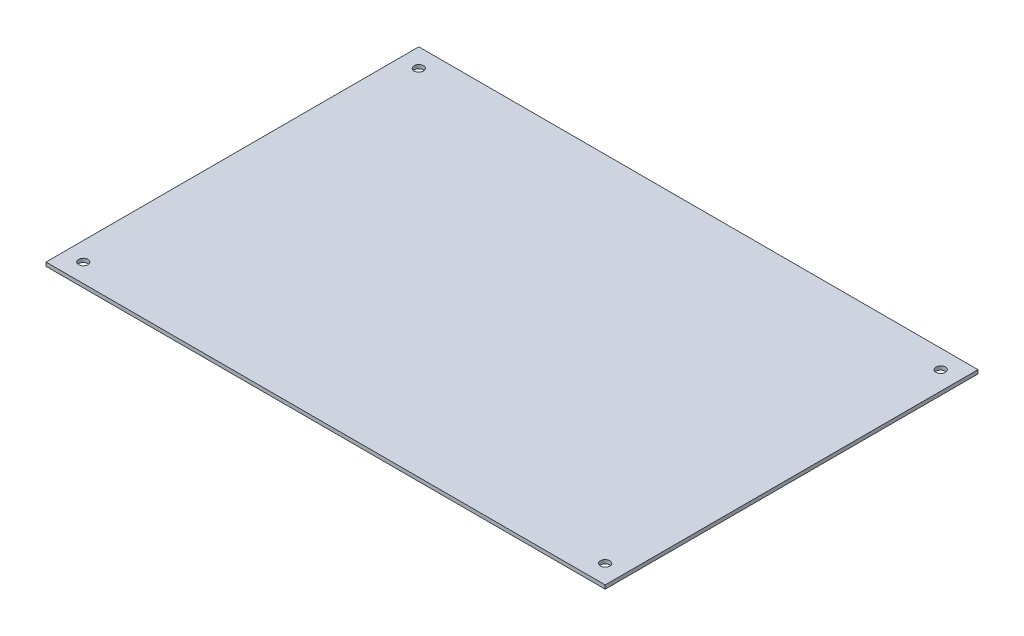
ISO-10303-21;
HEADER;
FILE_DESCRIPTION(('STEP AP214'),'2;1');
FILE_NAME('part.step','',(''),(''),'','','');
FILE_SCHEMA(('AUTOMOTIVE_DESIGN { 1 0 10303 214 1 1 1 1 }'));
ENDSEC;
DATA;
#1=APPLICATION_CONTEXT('core data for automotive mechanical design processes');
#2=APPLICATION_PROTOCOL_DEFINITION('international standard','automotive_design',2000,#1);
#3=PRODUCT_CONTEXT('',#1,'mechanical');
#4=PRODUCT('Part','Part','',(#3));
#5=PRODUCT_RELATED_PRODUCT_CATEGORY('part','',(#4));
#6=PRODUCT_DEFINITION_FORMATION('','',#4);
#7=PRODUCT_DEFINITION_CONTEXT('part definition',#1,'design');
#8=PRODUCT_DEFINITION('design','',#6,#7);
#9=PRODUCT_DEFINITION_SHAPE('','',#8);
#10=(LENGTH_UNIT() NAMED_UNIT(*) SI_UNIT(.MILLI.,.METRE.));
#11=(NAMED_UNIT(*) PLANE_ANGLE_UNIT() SI_UNIT($,.RADIAN.));
#12=(NAMED_UNIT(*) SI_UNIT($,.STERADIAN.) SOLID_ANGLE_UNIT());
#13=UNCERTAINTY_MEASURE_WITH_UNIT(LENGTH_MEASURE(1.E-05),#10,'distance_accuracy_value','');
#14=(GEOMETRIC_REPRESENTATION_CONTEXT(3) GLOBAL_UNCERTAINTY_ASSIGNED_CONTEXT((#13)) GLOBAL_UNIT_ASSIGNED_CONTEXT((#10,
#11,#12)) REPRESENTATION_CONTEXT('',''));
#15=CARTESIAN_POINT('',(0.,0.,0.));
#16=DIRECTION('',(0.,0.,1.));
#17=DIRECTION('',(1.,0.,0.));
#18=AXIS2_PLACEMENT_3D('',#15,#16,#17);
#19=CARTESIAN_POINT('',(263.05542944957,2.,0.));
#20=DIRECTION('',(1.,0.,0.));
#21=DIRECTION('',(0.,0.,-1.));
#22=AXIS2_PLACEMENT_3D('',#19,#20,#21);
#23=PLANE('',#22);
#24=DIRECTION('',(0.,0.,1.));
#25=VECTOR('',#24,1.);
#26=CARTESIAN_POINT('',(263.05542944957,0.,0.));
#27=LINE('',#26,#25);
#28=CARTESIAN_POINT('',(263.05542944957,0.,-34.7359277457848));
#29=VERTEX_POINT('',#28);
#30=CARTESIAN_POINT('',(263.05542944957,0.,165.264072254215));
#31=VERTEX_POINT('',#30);
#32=EDGE_CURVE('E114',#29,#31,#27,.T.);
#33=ORIENTED_EDGE('',*,*,#32,.F.);
#34=DIRECTION('',(0.,-1.,0.));
#35=VECTOR('',#34,1.);
#36=CARTESIAN_POINT('',(263.05542944957,2.,-34.7359277457848));
#37=LINE('',#36,#35);
#38=CARTESIAN_POINT('',(263.05542944957,2.,-34.7359277457848));
#39=VERTEX_POINT('',#38);
#40=EDGE_CURVE('E11',#39,#29,#37,.T.);
#41=ORIENTED_EDGE('',*,*,#40,.F.);
#42=DIRECTION('',(0.,0.,1.));
#43=VECTOR('',#42,1.);
#44=CARTESIAN_POINT('',(263.05542944957,2.,0.));
#45=LINE('',#44,#43);
#46=CARTESIAN_POINT('',(263.05542944957,2.,165.264072254215));
#47=VERTEX_POINT('',#46);
#48=EDGE_CURVE('E95',#39,#47,#45,.T.);
#49=ORIENTED_EDGE('',*,*,#48,.T.);
#50=DIRECTION('',(0.,-1.,0.));
#51=VECTOR('',#50,1.);
#52=CARTESIAN_POINT('',(263.05542944957,2.,165.264072254215));
#53=LINE('',#52,#51);
#54=EDGE_CURVE('E74',#47,#31,#53,.T.);
#55=ORIENTED_EDGE('',*,*,#54,.T.);
#56=EDGE_LOOP('',(#33,#41,#49,#55));
#57=FACE_BOUND('',#56,.T.);
#58=ADVANCED_FACE('F34',(#57),#23,.T.);
#59=CARTESIAN_POINT('',(0.,2.,-34.7359277457848));
#60=DIRECTION('',(0.,0.,-1.));
#61=DIRECTION('',(-1.,0.,0.));
#62=AXIS2_PLACEMENT_3D('',#59,#60,#61);
#63=PLANE('',#62);
#64=DIRECTION('',(1.,0.,0.));
#65=VECTOR('',#64,1.);
#66=CARTESIAN_POINT('',(0.,0.,-34.7359277457848));
#67=LINE('',#66,#65);
#68=CARTESIAN_POINT('',(-36.94457055043,0.,-34.7359277457848));
#69=VERTEX_POINT('',#68);
#70=EDGE_CURVE('E86',#69,#29,#67,.T.);
#71=ORIENTED_EDGE('',*,*,#70,.F.);
#72=DIRECTION('',(0.,-1.,0.));
#73=VECTOR('',#72,1.);
#74=CARTESIAN_POINT('',(-36.94457055043,2.,-34.7359277457848));
#75=LINE('',#74,#73);
#76=CARTESIAN_POINT('',(-36.94457055043,2.,-34.7359277457848));
#77=VERTEX_POINT('',#76);
#78=EDGE_CURVE('E43',#77,#69,#75,.T.);
#79=ORIENTED_EDGE('',*,*,#78,.F.);
#80=DIRECTION('',(1.,0.,0.));
#81=VECTOR('',#80,1.);
#82=CARTESIAN_POINT('',(0.,2.,-34.7359277457848));
#83=LINE('',#82,#81);
#84=EDGE_CURVE('E84',#77,#39,#83,.T.);
#85=ORIENTED_EDGE('',*,*,#84,.T.);
#86=ORIENTED_EDGE('',*,*,#40,.T.);
#87=EDGE_LOOP('',(#71,#79,#85,#86));
#88=FACE_BOUND('',#87,.T.);
#89=ADVANCED_FACE('F82',(#88),#63,.T.);
#90=CARTESIAN_POINT('',(-36.94457055043,2.,0.));
#91=DIRECTION('',(1.,0.,0.));
#92=DIRECTION('',(0.,0.,-1.));
#93=AXIS2_PLACEMENT_3D('',#90,#91,#92);
#94=PLANE('',#93);
#95=DIRECTION('',(0.,0.,1.));
#96=VECTOR('',#95,1.);
#97=CARTESIAN_POINT('',(-36.94457055043,0.,0.));
#98=LINE('',#97,#96);
#99=CARTESIAN_POINT('',(-36.94457055043,0.,165.264072254215));
#100=VERTEX_POINT('',#99);
#101=EDGE_CURVE('E117',#69,#100,#98,.T.);
#102=ORIENTED_EDGE('',*,*,#101,.T.);
#103=DIRECTION('',(0.,-1.,0.));
#104=VECTOR('',#103,1.);
#105=CARTESIAN_POINT('',(-36.94457055043,2.,165.264072254215));
#106=LINE('',#105,#104);
#107=CARTESIAN_POINT('',(-36.94457055043,2.,165.264072254215));
#108=VERTEX_POINT('',#107);
#109=EDGE_CURVE('E89',#108,#100,#106,.T.);
#110=ORIENTED_EDGE('',*,*,#109,.F.);
#111=DIRECTION('',(0.,0.,1.));
#112=VECTOR('',#111,1.);
#113=CARTESIAN_POINT('',(-36.94457055043,2.,0.));
#114=LINE('',#113,#112);
#115=EDGE_CURVE('E91',#77,#108,#114,.T.);
#116=ORIENTED_EDGE('',*,*,#115,.F.);
#117=ORIENTED_EDGE('',*,*,#78,.T.);
#118=EDGE_LOOP('',(#102,#110,#116,#117));
#119=FACE_BOUND('',#118,.T.);
#120=ADVANCED_FACE('F92',(#119),#94,.F.);
#121=CARTESIAN_POINT('',(-26.94457055043,2.,-24.7359277457848));
#122=DIRECTION('',(0.,-1.,0.));
#123=DIRECTION('',(0.,0.,-1.));
#124=AXIS2_PLACEMENT_3D('',#121,#122,#123);
#125=CYLINDRICAL_SURFACE('',#124,2.5);
#126=CARTESIAN_POINT('',(-26.94457055043,2.,-24.7359277457848));
#127=DIRECTION('',(0.,1.,0.));
#128=DIRECTION('',(0.,0.,1.));
#129=AXIS2_PLACEMENT_3D('',#126,#127,#128);
#130=CIRCLE('',#129,2.5);
#131=CARTESIAN_POINT('',(-26.94457055043,2.,-22.2359277457848));
#132=VERTEX_POINT('',#131);
#133=EDGE_CURVE('E97',#132,#132,#130,.T.);
#134=ORIENTED_EDGE('',*,*,#133,.T.);
#135=EDGE_LOOP('',(#134));
#136=FACE_BOUND('',#135,.T.);
#137=CARTESIAN_POINT('',(-26.94457055043,0.,-24.7359277457848));
#138=DIRECTION('',(0.,1.,0.));
#139=DIRECTION('',(0.,0.,1.));
#140=AXIS2_PLACEMENT_3D('',#137,#138,#139);
#141=CIRCLE('',#140,2.5);
#142=CARTESIAN_POINT('',(-26.94457055043,0.,-22.2359277457848));
#143=VERTEX_POINT('',#142);
#144=EDGE_CURVE('E111',#143,#143,#141,.T.);
#145=ORIENTED_EDGE('',*,*,#144,.F.);
#146=EDGE_LOOP('',(#145));
#147=FACE_BOUND('',#146,.T.);
#148=ADVANCED_FACE('F133',(#136,#147),#125,.F.);
#149=CARTESIAN_POINT('',(253.05542944957,2.,-24.7359277457848));
#150=DIRECTION('',(0.,-1.,0.));
#151=DIRECTION('',(0.,0.,-1.));
#152=AXIS2_PLACEMENT_3D('',#149,#150,#151);
#153=CYLINDRICAL_SURFACE('',#152,2.50000000000002);
#154=CARTESIAN_POINT('',(253.05542944957,2.,-24.7359277457848));
#155=DIRECTION('',(0.,1.,0.));
#156=DIRECTION('',(0.,0.,1.));
#157=AXIS2_PLACEMENT_3D('',#154,#155,#156);
#158=CIRCLE('',#157,2.50000000000002);
#159=CARTESIAN_POINT('',(253.05542944957,2.,-22.2359277457848));
#160=VERTEX_POINT('',#159);
#161=EDGE_CURVE('E245',#160,#160,#158,.T.);
#162=ORIENTED_EDGE('',*,*,#161,.T.);
#163=EDGE_LOOP('',(#162));
#164=FACE_BOUND('',#163,.T.);
#165=CARTESIAN_POINT('',(253.05542944957,0.,-24.7359277457848));
#166=DIRECTION('',(0.,1.,0.));
#167=DIRECTION('',(0.,0.,1.));
#168=AXIS2_PLACEMENT_3D('',#165,#166,#167);
#169=CIRCLE('',#168,2.50000000000002);
#170=CARTESIAN_POINT('',(253.05542944957,0.,-22.2359277457848));
#171=VERTEX_POINT('',#170);
#172=EDGE_CURVE('E108',#171,#171,#169,.T.);
#173=ORIENTED_EDGE('',*,*,#172,.F.);
#174=EDGE_LOOP('',(#173));
#175=FACE_BOUND('',#174,.T.);
#176=ADVANCED_FACE('F136',(#164,#175),#153,.F.);
#177=CARTESIAN_POINT('',(253.05542944957,2.,155.264072254215));
#178=DIRECTION('',(0.,-1.,0.));
#179=DIRECTION('',(0.,0.,-1.));
#180=AXIS2_PLACEMENT_3D('',#177,#178,#179);
#181=CYLINDRICAL_SURFACE('',#180,2.50000000000002);
#182=CARTESIAN_POINT('',(253.05542944957,2.,155.264072254215));
#183=DIRECTION('',(0.,1.,0.));
#184=DIRECTION('',(0.,0.,1.));
#185=AXIS2_PLACEMENT_3D('',#182,#183,#184);
#186=CIRCLE('',#185,2.50000000000002);
#187=CARTESIAN_POINT('',(253.05542944957,2.,157.764072254215));
#188=VERTEX_POINT('',#187);
#189=EDGE_CURVE('E150',#188,#188,#186,.T.);
#190=ORIENTED_EDGE('',*,*,#189,.T.);
#191=EDGE_LOOP('',(#190));
#192=FACE_BOUND('',#191,.T.);
#193=CARTESIAN_POINT('',(253.05542944957,0.,155.264072254215));
#194=DIRECTION('',(0.,1.,0.));
#195=DIRECTION('',(0.,0.,1.));
#196=AXIS2_PLACEMENT_3D('',#193,#194,#195);
#197=CIRCLE('',#196,2.50000000000002);
#198=CARTESIAN_POINT('',(253.05542944957,0.,157.764072254215));
#199=VERTEX_POINT('',#198);
#200=EDGE_CURVE('E105',#199,#199,#197,.T.);
#201=ORIENTED_EDGE('',*,*,#200,.F.);
#202=EDGE_LOOP('',(#201));
#203=FACE_BOUND('',#202,.T.);
#204=ADVANCED_FACE('F139',(#192,#203),#181,.F.);
#205=CARTESIAN_POINT('',(-26.94457055043,2.,155.264072254215));
#206=DIRECTION('',(0.,-1.,0.));
#207=DIRECTION('',(0.,0.,-1.));
#208=AXIS2_PLACEMENT_3D('',#205,#206,#207);
#209=CYLINDRICAL_SURFACE('',#208,2.5);
#210=CARTESIAN_POINT('',(-26.94457055043,2.,155.264072254215));
#211=DIRECTION('',(0.,1.,0.));
#212=DIRECTION('',(0.,0.,1.));
#213=AXIS2_PLACEMENT_3D('',#210,#211,#212);
#214=CIRCLE('',#213,2.5);
#215=CARTESIAN_POINT('',(-26.94457055043,2.,157.764072254215));
#216=VERTEX_POINT('',#215);
#217=EDGE_CURVE('E120',#216,#216,#214,.T.);
#218=ORIENTED_EDGE('',*,*,#217,.T.);
#219=EDGE_LOOP('',(#218));
#220=FACE_BOUND('',#219,.T.);
#221=CARTESIAN_POINT('',(-26.94457055043,0.,155.264072254215));
#222=DIRECTION('',(0.,1.,0.));
#223=DIRECTION('',(0.,0.,1.));
#224=AXIS2_PLACEMENT_3D('',#221,#222,#223);
#225=CIRCLE('',#224,2.5);
#226=CARTESIAN_POINT('',(-26.94457055043,0.,157.764072254215));
#227=VERTEX_POINT('',#226);
#228=EDGE_CURVE('E102',#227,#227,#225,.T.);
#229=ORIENTED_EDGE('',*,*,#228,.F.);
#230=EDGE_LOOP('',(#229));
#231=FACE_BOUND('',#230,.T.);
#232=ADVANCED_FACE('F36',(#220,#231),#209,.F.);
#233=CARTESIAN_POINT('',(0.,2.,165.264072254215));
#234=DIRECTION('',(0.,0.,-1.));
#235=DIRECTION('',(-1.,0.,0.));
#236=AXIS2_PLACEMENT_3D('',#233,#234,#235);
#237=PLANE('',#236);
#238=DIRECTION('',(1.,0.,0.));
#239=VECTOR('',#238,1.);
#240=CARTESIAN_POINT('',(0.,0.,165.264072254215));
#241=LINE('',#240,#239);
#242=EDGE_CURVE('E67',#100,#31,#241,.T.);
#243=ORIENTED_EDGE('',*,*,#242,.T.);
#244=ORIENTED_EDGE('',*,*,#54,.F.);
#245=DIRECTION('',(1.,0.,0.));
#246=VECTOR('',#245,1.);
#247=CARTESIAN_POINT('',(0.,2.,165.264072254215));
#248=LINE('',#247,#246);
#249=EDGE_CURVE('E51',#108,#47,#248,.T.);
#250=ORIENTED_EDGE('',*,*,#249,.F.);
#251=ORIENTED_EDGE('',*,*,#109,.T.);
#252=EDGE_LOOP('',(#243,#244,#250,#251));
#253=FACE_BOUND('',#252,.T.);
#254=ADVANCED_FACE('F123',(#253),#237,.F.);
#255=CARTESIAN_POINT('',(0.,2.,0.));
#256=DIRECTION('',(0.,1.,0.));
#257=DIRECTION('',(0.,0.,1.));
#258=AXIS2_PLACEMENT_3D('',#255,#256,#257);
#259=PLANE('',#258);
#260=ORIENTED_EDGE('',*,*,#217,.F.);
#261=EDGE_LOOP('',(#260));
#262=FACE_BOUND('',#261,.T.);
#263=ORIENTED_EDGE('',*,*,#189,.F.);
#264=EDGE_LOOP('',(#263));
#265=FACE_BOUND('',#264,.T.);
#266=ORIENTED_EDGE('',*,*,#161,.F.);
#267=EDGE_LOOP('',(#266));
#268=FACE_BOUND('',#267,.T.);
#269=ORIENTED_EDGE('',*,*,#133,.F.);
#270=EDGE_LOOP('',(#269));
#271=FACE_BOUND('',#270,.T.);
#272=ORIENTED_EDGE('',*,*,#48,.F.);
#273=ORIENTED_EDGE('',*,*,#84,.F.);
#274=ORIENTED_EDGE('',*,*,#115,.T.);
#275=ORIENTED_EDGE('',*,*,#249,.T.);
#276=EDGE_LOOP('',(#272,#273,#274,#275));
#277=FACE_BOUND('',#276,.T.);
#278=ADVANCED_FACE('F94',(#262,#265,#268,#271,#277),#259,.T.);
#279=CARTESIAN_POINT('',(0.,0.,0.));
#280=DIRECTION('',(0.,1.,0.));
#281=DIRECTION('',(0.,0.,1.));
#282=AXIS2_PLACEMENT_3D('',#279,#280,#281);
#283=PLANE('',#282);
#284=ORIENTED_EDGE('',*,*,#228,.T.);
#285=EDGE_LOOP('',(#284));
#286=FACE_BOUND('',#285,.T.);
#287=ORIENTED_EDGE('',*,*,#200,.T.);
#288=EDGE_LOOP('',(#287));
#289=FACE_BOUND('',#288,.T.);
#290=ORIENTED_EDGE('',*,*,#172,.T.);
#291=EDGE_LOOP('',(#290));
#292=FACE_BOUND('',#291,.T.);
#293=ORIENTED_EDGE('',*,*,#144,.T.);
#294=EDGE_LOOP('',(#293));
#295=FACE_BOUND('',#294,.T.);
#296=ORIENTED_EDGE('',*,*,#32,.T.);
#297=ORIENTED_EDGE('',*,*,#242,.F.);
#298=ORIENTED_EDGE('',*,*,#101,.F.);
#299=ORIENTED_EDGE('',*,*,#70,.T.);
#300=EDGE_LOOP('',(#296,#297,#298,#299));
#301=FACE_BOUND('',#300,.T.);
#302=ADVANCED_FACE('F124',(#286,#289,#292,#295,#301),#283,.F.);
#303=CLOSED_SHELL('',(#58,#89,#120,#148,#176,#204,#232,#254,#278,#302));
#304=MANIFOLD_SOLID_BREP('B2',#303);
#305=ADVANCED_BREP_SHAPE_REPRESENTATION('',(#18,#304),#14);
#306=SHAPE_DEFINITION_REPRESENTATION(#9,#305);
ENDSEC;
END-ISO-10303-21;
